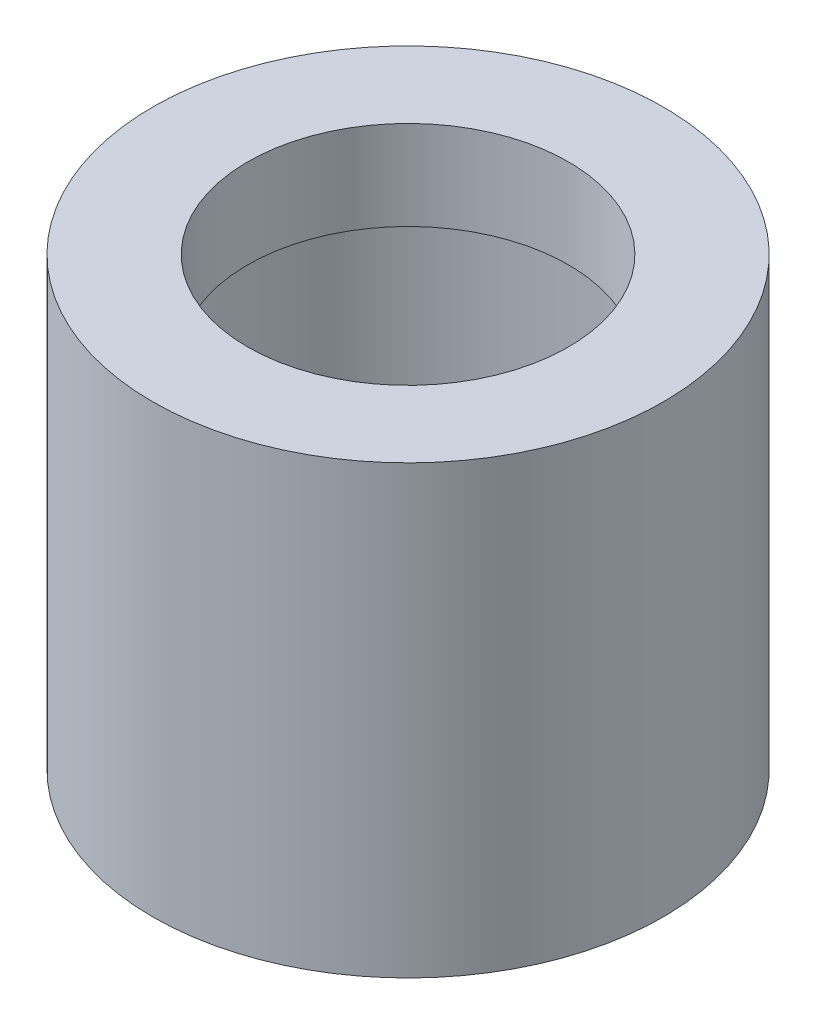
ISO-10303-21;
HEADER;
FILE_DESCRIPTION(('STEP AP214'),'2;1');
FILE_NAME('part.step','',(''),(''),'','','');
FILE_SCHEMA(('AUTOMOTIVE_DESIGN { 1 0 10303 214 1 1 1 1 }'));
ENDSEC;
DATA;
#1=APPLICATION_CONTEXT('core data for automotive mechanical design processes');
#2=APPLICATION_PROTOCOL_DEFINITION('international standard','automotive_design',2000,#1);
#3=PRODUCT_CONTEXT('',#1,'mechanical');
#4=PRODUCT('Part','Part','',(#3));
#5=PRODUCT_RELATED_PRODUCT_CATEGORY('part','',(#4));
#6=PRODUCT_DEFINITION_FORMATION('','',#4);
#7=PRODUCT_DEFINITION_CONTEXT('part definition',#1,'design');
#8=PRODUCT_DEFINITION('design','',#6,#7);
#9=PRODUCT_DEFINITION_SHAPE('','',#8);
#10=(LENGTH_UNIT() NAMED_UNIT(*) SI_UNIT(.MILLI.,.METRE.));
#11=(NAMED_UNIT(*) PLANE_ANGLE_UNIT() SI_UNIT($,.RADIAN.));
#12=(NAMED_UNIT(*) SI_UNIT($,.STERADIAN.) SOLID_ANGLE_UNIT());
#13=UNCERTAINTY_MEASURE_WITH_UNIT(LENGTH_MEASURE(1.E-05),#10,'distance_accuracy_value','');
#14=(GEOMETRIC_REPRESENTATION_CONTEXT(3) GLOBAL_UNCERTAINTY_ASSIGNED_CONTEXT((#13)) GLOBAL_UNIT_ASSIGNED_CONTEXT((#10,
#11,#12)) REPRESENTATION_CONTEXT('',''));
#15=CARTESIAN_POINT('',(0.,0.,0.));
#16=DIRECTION('',(0.,0.,1.));
#17=DIRECTION('',(1.,0.,0.));
#18=AXIS2_PLACEMENT_3D('',#15,#16,#17);
#19=CARTESIAN_POINT('',(0.,0.,0.));
#20=DIRECTION('',(0.,1.,0.));
#21=DIRECTION('',(0.,0.,1.));
#22=AXIS2_PLACEMENT_3D('',#19,#20,#21);
#23=PLANE('',#22);
#24=CARTESIAN_POINT('',(0.,0.,0.));
#25=DIRECTION('',(0.,1.,0.));
#26=DIRECTION('',(0.,0.,1.));
#27=AXIS2_PLACEMENT_3D('',#24,#25,#26);
#28=CIRCLE('',#27,13.45);
#29=CARTESIAN_POINT('',(0.,0.,13.45));
#30=VERTEX_POINT('',#29);
#31=EDGE_CURVE('E10',#30,#30,#28,.T.);
#32=ORIENTED_EDGE('',*,*,#31,.F.);
#33=EDGE_LOOP('',(#32));
#34=FACE_BOUND('',#33,.T.);
#35=CARTESIAN_POINT('',(0.,0.,0.));
#36=DIRECTION('',(0.,1.,0.));
#37=DIRECTION('',(0.,0.,1.));
#38=AXIS2_PLACEMENT_3D('',#35,#36,#37);
#39=CIRCLE('',#38,10.9);
#40=CARTESIAN_POINT('',(0.,0.,10.9));
#41=VERTEX_POINT('',#40);
#42=EDGE_CURVE('E38',#41,#41,#39,.T.);
#43=ORIENTED_EDGE('',*,*,#42,.T.);
#44=EDGE_LOOP('',(#43));
#45=FACE_BOUND('',#44,.T.);
#46=ADVANCED_FACE('F31',(#34,#45),#23,.F.);
#47=CARTESIAN_POINT('',(0.,18.8,0.));
#48=DIRECTION('',(0.,-1.,0.));
#49=DIRECTION('',(0.,0.,-1.));
#50=AXIS2_PLACEMENT_3D('',#47,#48,#49);
#51=CYLINDRICAL_SURFACE('',#50,13.45);
#52=ORIENTED_EDGE('',*,*,#31,.T.);
#53=EDGE_LOOP('',(#52));
#54=FACE_BOUND('',#53,.T.);
#55=CARTESIAN_POINT('',(0.,23.5,0.));
#56=DIRECTION('',(0.,1.,0.));
#57=DIRECTION('',(0.,0.,1.));
#58=AXIS2_PLACEMENT_3D('',#55,#56,#57);
#59=CIRCLE('',#58,13.45);
#60=CARTESIAN_POINT('',(0.,23.5,13.45));
#61=VERTEX_POINT('',#60);
#62=EDGE_CURVE('E46',#61,#61,#59,.T.);
#63=ORIENTED_EDGE('',*,*,#62,.F.);
#64=EDGE_LOOP('',(#63));
#65=FACE_BOUND('',#64,.T.);
#66=ADVANCED_FACE('F33',(#54,#65),#51,.T.);
#67=CARTESIAN_POINT('',(0.,18.8,0.));
#68=DIRECTION('',(0.,-1.,0.));
#69=DIRECTION('',(0.,0.,-1.));
#70=AXIS2_PLACEMENT_3D('',#67,#68,#69);
#71=CYLINDRICAL_SURFACE('',#70,10.9);
#72=CARTESIAN_POINT('',(0.,18.8,0.));
#73=DIRECTION('',(0.,1.,0.));
#74=DIRECTION('',(0.,0.,1.));
#75=AXIS2_PLACEMENT_3D('',#72,#73,#74);
#76=CIRCLE('',#75,10.9);
#77=CARTESIAN_POINT('',(0.,18.8,10.9));
#78=VERTEX_POINT('',#77);
#79=EDGE_CURVE('E42',#78,#78,#76,.T.);
#80=ORIENTED_EDGE('',*,*,#79,.T.);
#81=EDGE_LOOP('',(#80));
#82=FACE_BOUND('',#81,.T.);
#83=ORIENTED_EDGE('',*,*,#42,.F.);
#84=EDGE_LOOP('',(#83));
#85=FACE_BOUND('',#84,.T.);
#86=ADVANCED_FACE('F71',(#82,#85),#71,.F.);
#87=CARTESIAN_POINT('',(0.,18.8,0.));
#88=DIRECTION('',(0.,1.,0.));
#89=DIRECTION('',(0.,0.,1.));
#90=AXIS2_PLACEMENT_3D('',#87,#88,#89);
#91=PLANE('',#90);
#92=CARTESIAN_POINT('',(0.,18.8,0.));
#93=DIRECTION('',(0.,1.,0.));
#94=DIRECTION('',(0.,0.,1.));
#95=AXIS2_PLACEMENT_3D('',#92,#93,#94);
#96=CIRCLE('',#95,8.45);
#97=CARTESIAN_POINT('',(0.,18.8,8.45));
#98=VERTEX_POINT('',#97);
#99=EDGE_CURVE('E52',#98,#98,#96,.T.);
#100=ORIENTED_EDGE('',*,*,#99,.T.);
#101=EDGE_LOOP('',(#100));
#102=FACE_BOUND('',#101,.T.);
#103=ORIENTED_EDGE('',*,*,#79,.F.);
#104=EDGE_LOOP('',(#103));
#105=FACE_BOUND('',#104,.T.);
#106=ADVANCED_FACE('F63',(#102,#105),#91,.F.);
#107=CARTESIAN_POINT('',(0.,23.5,0.));
#108=DIRECTION('',(0.,1.,0.));
#109=DIRECTION('',(0.,0.,1.));
#110=AXIS2_PLACEMENT_3D('',#107,#108,#109);
#111=PLANE('',#110);
#112=ORIENTED_EDGE('',*,*,#62,.T.);
#113=EDGE_LOOP('',(#112));
#114=FACE_BOUND('',#113,.T.);
#115=CARTESIAN_POINT('',(0.,23.5,0.));
#116=DIRECTION('',(0.,1.,0.));
#117=DIRECTION('',(0.,0.,1.));
#118=AXIS2_PLACEMENT_3D('',#115,#116,#117);
#119=CIRCLE('',#118,8.45);
#120=CARTESIAN_POINT('',(0.,23.5,8.45));
#121=VERTEX_POINT('',#120);
#122=EDGE_CURVE('E51',#121,#121,#119,.T.);
#123=ORIENTED_EDGE('',*,*,#122,.F.);
#124=EDGE_LOOP('',(#123));
#125=FACE_BOUND('',#124,.T.);
#126=ADVANCED_FACE('F61',(#114,#125),#111,.T.);
#127=CARTESIAN_POINT('',(0.,23.5,0.));
#128=DIRECTION('',(0.,-1.,0.));
#129=DIRECTION('',(0.,0.,-1.));
#130=AXIS2_PLACEMENT_3D('',#127,#128,#129);
#131=CYLINDRICAL_SURFACE('',#130,8.45);
#132=ORIENTED_EDGE('',*,*,#122,.T.);
#133=EDGE_LOOP('',(#132));
#134=FACE_BOUND('',#133,.T.);
#135=ORIENTED_EDGE('',*,*,#99,.F.);
#136=EDGE_LOOP('',(#135));
#137=FACE_BOUND('',#136,.T.);
#138=ADVANCED_FACE('F58',(#134,#137),#131,.F.);
#139=CLOSED_SHELL('',(#46,#66,#86,#106,#126,#138));
#140=MANIFOLD_SOLID_BREP('B2',#139);
#141=ADVANCED_BREP_SHAPE_REPRESENTATION('',(#18,#140),#14);
#142=SHAPE_DEFINITION_REPRESENTATION(#9,#141);
ENDSEC;
END-ISO-10303-21;
